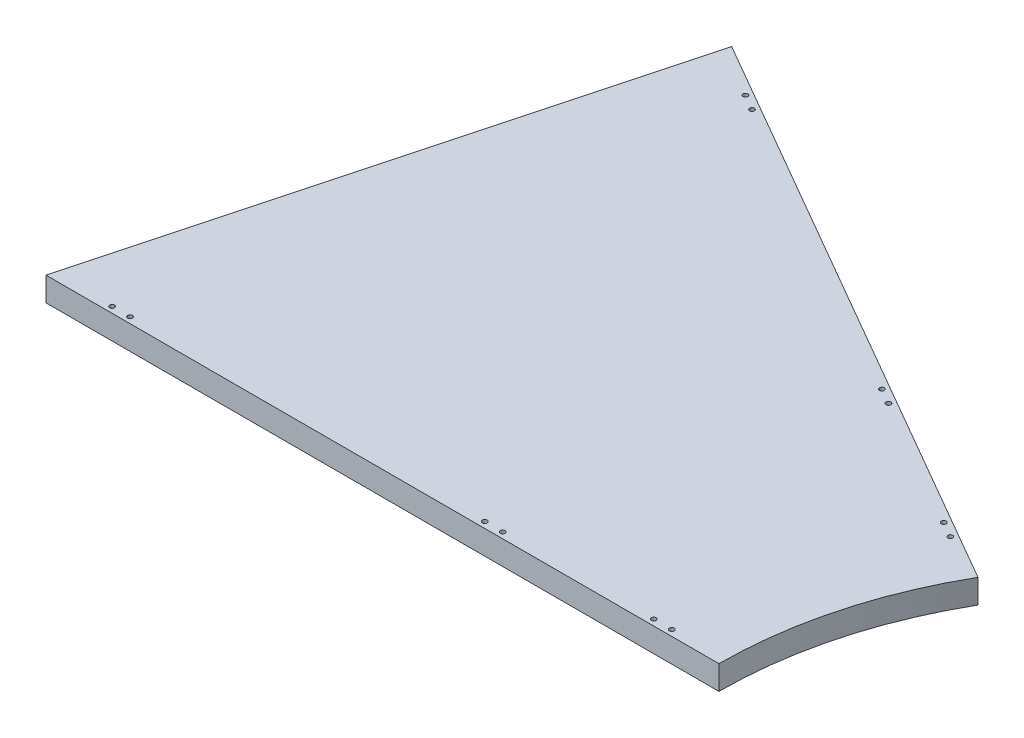
ISO-10303-21;
HEADER;
FILE_DESCRIPTION(('STEP AP214'),'2;1');
FILE_NAME('part.step','',(''),(''),'','','');
FILE_SCHEMA(('AUTOMOTIVE_DESIGN { 1 0 10303 214 1 1 1 1 }'));
ENDSEC;
DATA;
#1=APPLICATION_CONTEXT('core data for automotive mechanical design processes');
#2=APPLICATION_PROTOCOL_DEFINITION('international standard','automotive_design',2000,#1);
#3=PRODUCT_CONTEXT('',#1,'mechanical');
#4=PRODUCT('Part','Part','',(#3));
#5=PRODUCT_RELATED_PRODUCT_CATEGORY('part','',(#4));
#6=PRODUCT_DEFINITION_FORMATION('','',#4);
#7=PRODUCT_DEFINITION_CONTEXT('part definition',#1,'design');
#8=PRODUCT_DEFINITION('design','',#6,#7);
#9=PRODUCT_DEFINITION_SHAPE('','',#8);
#10=(LENGTH_UNIT() NAMED_UNIT(*) SI_UNIT(.MILLI.,.METRE.));
#11=(NAMED_UNIT(*) PLANE_ANGLE_UNIT() SI_UNIT($,.RADIAN.));
#12=(NAMED_UNIT(*) SI_UNIT($,.STERADIAN.) SOLID_ANGLE_UNIT());
#13=UNCERTAINTY_MEASURE_WITH_UNIT(LENGTH_MEASURE(1.E-05),#10,'distance_accuracy_value','');
#14=(GEOMETRIC_REPRESENTATION_CONTEXT(3) GLOBAL_UNCERTAINTY_ASSIGNED_CONTEXT((#13)) GLOBAL_UNIT_ASSIGNED_CONTEXT((#10,
#11,#12)) REPRESENTATION_CONTEXT('',''));
#15=CARTESIAN_POINT('',(0.,0.,0.));
#16=DIRECTION('',(0.,0.,1.));
#17=DIRECTION('',(1.,0.,0.));
#18=AXIS2_PLACEMENT_3D('',#15,#16,#17);
#19=CARTESIAN_POINT('',(-779.422863405994,20.,-450.000000000001));
#20=DIRECTION('',(0.965925826289068,0.,0.258819045102522));
#21=DIRECTION('',(0.258819045102522,0.,-0.965925826289068));
#22=AXIS2_PLACEMENT_3D('',#19,#20,#21);
#23=PLANE('',#22);
#24=DIRECTION('',(-0.258819045102522,0.,0.965925826289068));
#25=VECTOR('',#24,1.);
#26=CARTESIAN_POINT('',(-779.422863405994,0.,-450.000000000001));
#27=LINE('',#26,#25);
#28=CARTESIAN_POINT('',(-779.422863405994,0.,-450.000000000001));
#29=VERTEX_POINT('',#28);
#30=CARTESIAN_POINT('',(-900.,0.,0.));
#31=VERTEX_POINT('',#30);
#32=EDGE_CURVE('E113',#29,#31,#27,.T.);
#33=ORIENTED_EDGE('',*,*,#32,.T.);
#34=DIRECTION('',(0.,-1.,0.));
#35=VECTOR('',#34,1.);
#36=CARTESIAN_POINT('',(-900.,20.,0.));
#37=LINE('',#36,#35);
#38=CARTESIAN_POINT('',(-900.,20.,0.));
#39=VERTEX_POINT('',#38);
#40=EDGE_CURVE('E11',#39,#31,#37,.T.);
#41=ORIENTED_EDGE('',*,*,#40,.F.);
#42=DIRECTION('',(-0.258819045102522,0.,0.965925826289068));
#43=VECTOR('',#42,1.);
#44=CARTESIAN_POINT('',(-779.422863405994,20.,-450.000000000001));
#45=LINE('',#44,#43);
#46=CARTESIAN_POINT('',(-779.422863405994,20.,-450.000000000001));
#47=VERTEX_POINT('',#46);
#48=EDGE_CURVE('E97',#47,#39,#45,.T.);
#49=ORIENTED_EDGE('',*,*,#48,.F.);
#50=DIRECTION('',(0.,-1.,0.));
#51=VECTOR('',#50,1.);
#52=CARTESIAN_POINT('',(-779.422863405994,20.,-450.000000000001));
#53=LINE('',#52,#51);
#54=EDGE_CURVE('E109',#47,#29,#53,.T.);
#55=ORIENTED_EDGE('',*,*,#54,.T.);
#56=EDGE_LOOP('',(#33,#41,#49,#55));
#57=FACE_BOUND('',#56,.T.);
#58=ADVANCED_FACE('F45',(#57),#23,.F.);
#59=CARTESIAN_POINT('',(-340.,20.,0.));
#60=DIRECTION('',(0.,0.,-1.));
#61=DIRECTION('',(-1.,0.,0.));
#62=AXIS2_PLACEMENT_3D('',#59,#60,#61);
#63=PLANE('',#62);
#64=DIRECTION('',(1.,0.,0.));
#65=VECTOR('',#64,1.);
#66=CARTESIAN_POINT('',(-340.,0.,0.));
#67=LINE('',#66,#65);
#68=CARTESIAN_POINT('',(-340.,0.,0.));
#69=VERTEX_POINT('',#68);
#70=EDGE_CURVE('E102',#31,#69,#67,.T.);
#71=ORIENTED_EDGE('',*,*,#70,.T.);
#72=DIRECTION('',(0.,-1.,0.));
#73=VECTOR('',#72,1.);
#74=CARTESIAN_POINT('',(-340.,20.,0.));
#75=LINE('',#74,#73);
#76=CARTESIAN_POINT('',(-340.,20.,0.));
#77=VERTEX_POINT('',#76);
#78=EDGE_CURVE('E54',#77,#69,#75,.T.);
#79=ORIENTED_EDGE('',*,*,#78,.F.);
#80=DIRECTION('',(1.,0.,0.));
#81=VECTOR('',#80,1.);
#82=CARTESIAN_POINT('',(-340.,20.,0.));
#83=LINE('',#82,#81);
#84=EDGE_CURVE('E92',#39,#77,#83,.T.);
#85=ORIENTED_EDGE('',*,*,#84,.F.);
#86=ORIENTED_EDGE('',*,*,#40,.T.);
#87=EDGE_LOOP('',(#71,#79,#85,#86));
#88=FACE_BOUND('',#87,.T.);
#89=ADVANCED_FACE('F101',(#88),#63,.F.);
#90=CARTESIAN_POINT('',(0.,20.,0.));
#91=DIRECTION('',(0.,-1.,0.));
#92=DIRECTION('',(0.,0.,-1.));
#93=AXIS2_PLACEMENT_3D('',#90,#91,#92);
#94=CYLINDRICAL_SURFACE('',#93,340.);
#95=CARTESIAN_POINT('',(0.,0.,0.));
#96=DIRECTION('',(0.,-1.,0.));
#97=DIRECTION('',(0.,0.,1.));
#98=AXIS2_PLACEMENT_3D('',#95,#96,#97);
#99=CIRCLE('',#98,340.);
#100=CARTESIAN_POINT('',(-294.448637286709,0.,-170.));
#101=VERTEX_POINT('',#100);
#102=EDGE_CURVE('E79',#69,#101,#99,.T.);
#103=ORIENTED_EDGE('',*,*,#102,.T.);
#104=DIRECTION('',(0.,-1.,0.));
#105=VECTOR('',#104,1.);
#106=CARTESIAN_POINT('',(-294.448637286709,20.,-170.));
#107=LINE('',#106,#105);
#108=CARTESIAN_POINT('',(-294.448637286709,20.,-170.));
#109=VERTEX_POINT('',#108);
#110=EDGE_CURVE('E104',#109,#101,#107,.T.);
#111=ORIENTED_EDGE('',*,*,#110,.F.);
#112=CARTESIAN_POINT('',(0.,20.,0.));
#113=DIRECTION('',(0.,-1.,0.));
#114=DIRECTION('',(0.,0.,1.));
#115=AXIS2_PLACEMENT_3D('',#112,#113,#114);
#116=CIRCLE('',#115,340.);
#117=EDGE_CURVE('E95',#77,#109,#116,.T.);
#118=ORIENTED_EDGE('',*,*,#117,.F.);
#119=ORIENTED_EDGE('',*,*,#78,.T.);
#120=EDGE_LOOP('',(#103,#111,#118,#119));
#121=FACE_BOUND('',#120,.T.);
#122=ADVANCED_FACE('F105',(#121),#94,.F.);
#123=CARTESIAN_POINT('',(-294.448637286709,20.,-170.));
#124=DIRECTION('',(-0.500000000000001,0.,0.866025403784438));
#125=DIRECTION('',(0.866025403784438,0.,0.500000000000001));
#126=AXIS2_PLACEMENT_3D('',#123,#124,#125);
#127=PLANE('',#126);
#128=DIRECTION('',(-0.866025403784438,0.,-0.500000000000001));
#129=VECTOR('',#128,1.);
#130=CARTESIAN_POINT('',(-294.448637286709,0.,-170.));
#131=LINE('',#130,#129);
#132=EDGE_CURVE('E85',#101,#29,#131,.T.);
#133=ORIENTED_EDGE('',*,*,#132,.T.);
#134=ORIENTED_EDGE('',*,*,#54,.F.);
#135=DIRECTION('',(-0.866025403784438,0.,-0.500000000000001));
#136=VECTOR('',#135,1.);
#137=CARTESIAN_POINT('',(-294.448637286709,20.,-170.));
#138=LINE('',#137,#136);
#139=EDGE_CURVE('E62',#109,#47,#138,.T.);
#140=ORIENTED_EDGE('',*,*,#139,.F.);
#141=ORIENTED_EDGE('',*,*,#110,.T.);
#142=EDGE_LOOP('',(#133,#134,#140,#141));
#143=FACE_BOUND('',#142,.T.);
#144=ADVANCED_FACE('F127',(#143),#127,.F.);
#145=CARTESIAN_POINT('',(0.,20.,0.));
#146=DIRECTION('',(0.,1.,0.));
#147=DIRECTION('',(0.,0.,1.));
#148=AXIS2_PLACEMENT_3D('',#145,#146,#147);
#149=PLANE('',#148);
#150=CARTESIAN_POINT('',(-850.,20.,-5.));
#151=DIRECTION('',(0.,-1.,0.));
#152=DIRECTION('',(0.,0.,-1.));
#153=AXIS2_PLACEMENT_3D('',#150,#151,#152);
#154=CIRCLE('',#153,2.);
#155=CARTESIAN_POINT('',(-850.,20.,-7.));
#156=VERTEX_POINT('',#155);
#157=EDGE_CURVE('E117',#156,#156,#154,.T.);
#158=ORIENTED_EDGE('',*,*,#157,.T.);
#159=EDGE_LOOP('',(#158));
#160=FACE_BOUND('',#159,.T.);
#161=CARTESIAN_POINT('',(-384.25,20.,-5.));
#162=DIRECTION('',(0.,-1.,0.));
#163=DIRECTION('',(0.,0.,-1.));
#164=AXIS2_PLACEMENT_3D('',#161,#162,#163);
#165=CIRCLE('',#164,2.);
#166=CARTESIAN_POINT('',(-384.25,20.,-7.));
#167=VERTEX_POINT('',#166);
#168=EDGE_CURVE('E202',#167,#167,#165,.T.);
#169=ORIENTED_EDGE('',*,*,#168,.T.);
#170=EDGE_LOOP('',(#169));
#171=FACE_BOUND('',#170,.T.);
#172=CARTESIAN_POINT('',(-348.260642460939,20.,-195.294872981073));
#173=DIRECTION('',(0.,-1.,0.));
#174=DIRECTION('',(0.,0.,1.));
#175=AXIS2_PLACEMENT_3D('',#172,#173,#174);
#176=CIRCLE('',#175,2.);
#177=CARTESIAN_POINT('',(-348.260642460939,20.,-193.294872981073));
#178=VERTEX_POINT('',#177);
#179=EDGE_CURVE('E193',#178,#178,#176,.T.);
#180=ORIENTED_EDGE('',*,*,#179,.T.);
#181=EDGE_LOOP('',(#180));
#182=FACE_BOUND('',#181,.T.);
#183=CARTESIAN_POINT('',(-335.270261404173,20.,-187.794872981074));
#184=DIRECTION('',(0.,-1.,0.));
#185=DIRECTION('',(0.,0.,1.));
#186=AXIS2_PLACEMENT_3D('',#183,#184,#185);
#187=CIRCLE('',#186,1.99999999999999);
#188=CARTESIAN_POINT('',(-335.270261404173,20.,-185.794872981074));
#189=VERTEX_POINT('',#188);
#190=EDGE_CURVE('E216',#189,#189,#187,.T.);
#191=ORIENTED_EDGE('',*,*,#190,.T.);
#192=EDGE_LOOP('',(#191));
#193=FACE_BOUND('',#192,.T.);
#194=CARTESIAN_POINT('',(-457.085394700493,20.,-258.124872981072));
#195=DIRECTION('',(0.,-1.,0.));
#196=DIRECTION('',(0.,0.,1.));
#197=AXIS2_PLACEMENT_3D('',#194,#195,#196);
#198=CIRCLE('',#197,2.00000000000009);
#199=CARTESIAN_POINT('',(-457.085394700493,20.,-256.124872981072));
#200=VERTEX_POINT('',#199);
#201=EDGE_CURVE('E158',#200,#200,#198,.T.);
#202=ORIENTED_EDGE('',*,*,#201,.T.);
#203=EDGE_LOOP('',(#202));
#204=FACE_BOUND('',#203,.T.);
#205=CARTESIAN_POINT('',(-399.25,20.,-5.));
#206=DIRECTION('',(0.,-1.,0.));
#207=DIRECTION('',(0.,0.,-1.));
#208=AXIS2_PLACEMENT_3D('',#205,#206,#207);
#209=CIRCLE('',#208,2.);
#210=CARTESIAN_POINT('',(-399.25,20.,-7.));
#211=VERTEX_POINT('',#210);
#212=EDGE_CURVE('E159',#211,#211,#209,.T.);
#213=ORIENTED_EDGE('',*,*,#212,.T.);
#214=EDGE_LOOP('',(#213));
#215=FACE_BOUND('',#214,.T.);
#216=CARTESIAN_POINT('',(-524.91,20.,-5.));
#217=DIRECTION('',(0.,-1.,0.));
#218=DIRECTION('',(0.,0.,-1.));
#219=AXIS2_PLACEMENT_3D('',#216,#217,#218);
#220=CIRCLE('',#219,2.);
#221=CARTESIAN_POINT('',(-524.91,20.,-7.));
#222=VERTEX_POINT('',#221);
#223=EDGE_CURVE('E168',#222,#222,#220,.T.);
#224=ORIENTED_EDGE('',*,*,#223,.T.);
#225=EDGE_LOOP('',(#224));
#226=FACE_BOUND('',#225,.T.);
#227=CARTESIAN_POINT('',(-539.91,20.,-5.));
#228=DIRECTION('',(0.,-1.,0.));
#229=DIRECTION('',(0.,0.,-1.));
#230=AXIS2_PLACEMENT_3D('',#227,#228,#229);
#231=CIRCLE('',#230,2.);
#232=CARTESIAN_POINT('',(-539.91,20.,-7.));
#233=VERTEX_POINT('',#232);
#234=EDGE_CURVE('E176',#233,#233,#231,.T.);
#235=ORIENTED_EDGE('',*,*,#234,.T.);
#236=EDGE_LOOP('',(#235));
#237=FACE_BOUND('',#236,.T.);
#238=CARTESIAN_POINT('',(-835.,20.,-5.));
#239=DIRECTION('',(0.,-1.,0.));
#240=DIRECTION('',(0.,0.,-1.));
#241=AXIS2_PLACEMENT_3D('',#238,#239,#240);
#242=CIRCLE('',#241,2.);
#243=CARTESIAN_POINT('',(-835.,20.,-7.));
#244=VERTEX_POINT('',#243);
#245=EDGE_CURVE('E184',#244,#244,#242,.T.);
#246=ORIENTED_EDGE('',*,*,#245,.T.);
#247=EDGE_LOOP('',(#246));
#248=FACE_BOUND('',#247,.T.);
#249=CARTESIAN_POINT('',(-470.07577575726,20.,-265.624872981072));
#250=DIRECTION('',(0.,-1.,0.));
#251=DIRECTION('',(0.,0.,1.));
#252=AXIS2_PLACEMENT_3D('',#249,#250,#251);
#253=CIRCLE('',#252,2.);
#254=CARTESIAN_POINT('',(-470.07577575726,20.,-263.624872981072));
#255=VERTEX_POINT('',#254);
#256=EDGE_CURVE('E150',#255,#255,#253,.T.);
#257=ORIENTED_EDGE('',*,*,#256,.T.);
#258=EDGE_LOOP('',(#257));
#259=FACE_BOUND('',#258,.T.);
#260=CARTESIAN_POINT('',(-725.631212160012,20.,-413.169872981069));
#261=DIRECTION('',(0.,-1.,0.));
#262=DIRECTION('',(0.,0.,1.));
#263=AXIS2_PLACEMENT_3D('',#260,#261,#262);
#264=CIRCLE('',#263,2.0000000000002);
#265=CARTESIAN_POINT('',(-725.631212160012,20.,-411.169872981068));
#266=VERTEX_POINT('',#265);
#267=EDGE_CURVE('E142',#266,#266,#264,.T.);
#268=ORIENTED_EDGE('',*,*,#267,.T.);
#269=EDGE_LOOP('',(#268));
#270=FACE_BOUND('',#269,.T.);
#271=CARTESIAN_POINT('',(-738.621593216778,20.,-420.669872981068));
#272=DIRECTION('',(0.,-1.,0.));
#273=DIRECTION('',(0.,0.,1.));
#274=AXIS2_PLACEMENT_3D('',#271,#272,#273);
#275=CIRCLE('',#274,1.99999999999999);
#276=CARTESIAN_POINT('',(-738.621593216778,20.,-418.669872981068));
#277=VERTEX_POINT('',#276);
#278=EDGE_CURVE('E134',#277,#277,#275,.T.);
#279=ORIENTED_EDGE('',*,*,#278,.T.);
#280=EDGE_LOOP('',(#279));
#281=FACE_BOUND('',#280,.T.);
#282=ORIENTED_EDGE('',*,*,#48,.T.);
#283=ORIENTED_EDGE('',*,*,#84,.T.);
#284=ORIENTED_EDGE('',*,*,#117,.T.);
#285=ORIENTED_EDGE('',*,*,#139,.T.);
#286=EDGE_LOOP('',(#282,#283,#284,#285));
#287=FACE_BOUND('',#286,.T.);
#288=ADVANCED_FACE('F93',(#160,#171,#182,#193,#204,#215,#226,#237,#248,#259,#270,#281,#287),
#149,.T.);
#289=CARTESIAN_POINT('',(0.,0.,0.));
#290=DIRECTION('',(0.,1.,0.));
#291=DIRECTION('',(0.,0.,1.));
#292=AXIS2_PLACEMENT_3D('',#289,#290,#291);
#293=PLANE('',#292);
#294=CARTESIAN_POINT('',(-850.,0.,-5.));
#295=DIRECTION('',(0.,-1.,0.));
#296=DIRECTION('',(0.,0.,-1.));
#297=AXIS2_PLACEMENT_3D('',#294,#295,#296);
#298=CIRCLE('',#297,2.);
#299=CARTESIAN_POINT('',(-850.,0.,-7.));
#300=VERTEX_POINT('',#299);
#301=EDGE_CURVE('E192',#300,#300,#298,.T.);
#302=ORIENTED_EDGE('',*,*,#301,.F.);
#303=EDGE_LOOP('',(#302));
#304=FACE_BOUND('',#303,.T.);
#305=CARTESIAN_POINT('',(-384.25,0.,-5.));
#306=DIRECTION('',(0.,-1.,0.));
#307=DIRECTION('',(0.,0.,-1.));
#308=AXIS2_PLACEMENT_3D('',#305,#306,#307);
#309=CIRCLE('',#308,2.);
#310=CARTESIAN_POINT('',(-384.25,0.,-7.));
#311=VERTEX_POINT('',#310);
#312=EDGE_CURVE('E164',#311,#311,#309,.T.);
#313=ORIENTED_EDGE('',*,*,#312,.F.);
#314=EDGE_LOOP('',(#313));
#315=FACE_BOUND('',#314,.T.);
#316=CARTESIAN_POINT('',(-348.260642460939,0.,-195.294872981073));
#317=DIRECTION('',(0.,-1.,0.));
#318=DIRECTION('',(0.,0.,1.));
#319=AXIS2_PLACEMENT_3D('',#316,#317,#318);
#320=CIRCLE('',#319,2.);
#321=CARTESIAN_POINT('',(-348.260642460939,0.,-193.294872981073));
#322=VERTEX_POINT('',#321);
#323=EDGE_CURVE('E197',#322,#322,#320,.T.);
#324=ORIENTED_EDGE('',*,*,#323,.F.);
#325=EDGE_LOOP('',(#324));
#326=FACE_BOUND('',#325,.T.);
#327=CARTESIAN_POINT('',(-335.270261404173,0.,-187.794872981074));
#328=DIRECTION('',(0.,-1.,0.));
#329=DIRECTION('',(0.,0.,1.));
#330=AXIS2_PLACEMENT_3D('',#327,#328,#329);
#331=CIRCLE('',#330,1.99999999999999);
#332=CARTESIAN_POINT('',(-335.270261404173,0.,-185.794872981074));
#333=VERTEX_POINT('',#332);
#334=EDGE_CURVE('E198',#333,#333,#331,.T.);
#335=ORIENTED_EDGE('',*,*,#334,.F.);
#336=EDGE_LOOP('',(#335));
#337=FACE_BOUND('',#336,.T.);
#338=CARTESIAN_POINT('',(-457.085394700493,0.,-258.124872981072));
#339=DIRECTION('',(0.,-1.,0.));
#340=DIRECTION('',(0.,0.,1.));
#341=AXIS2_PLACEMENT_3D('',#338,#339,#340);
#342=CIRCLE('',#341,2.00000000000009);
#343=CARTESIAN_POINT('',(-457.085394700493,0.,-256.124872981072));
#344=VERTEX_POINT('',#343);
#345=EDGE_CURVE('E212',#344,#344,#342,.T.);
#346=ORIENTED_EDGE('',*,*,#345,.F.);
#347=EDGE_LOOP('',(#346));
#348=FACE_BOUND('',#347,.T.);
#349=CARTESIAN_POINT('',(-399.25,0.,-5.));
#350=DIRECTION('',(0.,-1.,0.));
#351=DIRECTION('',(0.,0.,-1.));
#352=AXIS2_PLACEMENT_3D('',#349,#350,#351);
#353=CIRCLE('',#352,2.);
#354=CARTESIAN_POINT('',(-399.25,0.,-7.));
#355=VERTEX_POINT('',#354);
#356=EDGE_CURVE('E163',#355,#355,#353,.T.);
#357=ORIENTED_EDGE('',*,*,#356,.F.);
#358=EDGE_LOOP('',(#357));
#359=FACE_BOUND('',#358,.T.);
#360=CARTESIAN_POINT('',(-524.91,0.,-5.));
#361=DIRECTION('',(0.,-1.,0.));
#362=DIRECTION('',(0.,0.,-1.));
#363=AXIS2_PLACEMENT_3D('',#360,#361,#362);
#364=CIRCLE('',#363,2.);
#365=CARTESIAN_POINT('',(-524.91,0.,-7.));
#366=VERTEX_POINT('',#365);
#367=EDGE_CURVE('E172',#366,#366,#364,.T.);
#368=ORIENTED_EDGE('',*,*,#367,.F.);
#369=EDGE_LOOP('',(#368));
#370=FACE_BOUND('',#369,.T.);
#371=CARTESIAN_POINT('',(-539.91,0.,-5.));
#372=DIRECTION('',(0.,-1.,0.));
#373=DIRECTION('',(0.,0.,-1.));
#374=AXIS2_PLACEMENT_3D('',#371,#372,#373);
#375=CIRCLE('',#374,2.);
#376=CARTESIAN_POINT('',(-539.91,0.,-7.));
#377=VERTEX_POINT('',#376);
#378=EDGE_CURVE('E180',#377,#377,#375,.T.);
#379=ORIENTED_EDGE('',*,*,#378,.F.);
#380=EDGE_LOOP('',(#379));
#381=FACE_BOUND('',#380,.T.);
#382=CARTESIAN_POINT('',(-835.,0.,-5.));
#383=DIRECTION('',(0.,-1.,0.));
#384=DIRECTION('',(0.,0.,-1.));
#385=AXIS2_PLACEMENT_3D('',#382,#383,#384);
#386=CIRCLE('',#385,2.);
#387=CARTESIAN_POINT('',(-835.,0.,-7.));
#388=VERTEX_POINT('',#387);
#389=EDGE_CURVE('E188',#388,#388,#386,.T.);
#390=ORIENTED_EDGE('',*,*,#389,.F.);
#391=EDGE_LOOP('',(#390));
#392=FACE_BOUND('',#391,.T.);
#393=CARTESIAN_POINT('',(-470.07577575726,0.,-265.624872981072));
#394=DIRECTION('',(0.,-1.,0.));
#395=DIRECTION('',(0.,0.,1.));
#396=AXIS2_PLACEMENT_3D('',#393,#394,#395);
#397=CIRCLE('',#396,2.);
#398=CARTESIAN_POINT('',(-470.07577575726,0.,-263.624872981072));
#399=VERTEX_POINT('',#398);
#400=EDGE_CURVE('E154',#399,#399,#397,.T.);
#401=ORIENTED_EDGE('',*,*,#400,.F.);
#402=EDGE_LOOP('',(#401));
#403=FACE_BOUND('',#402,.T.);
#404=CARTESIAN_POINT('',(-725.631212160012,0.,-413.169872981069));
#405=DIRECTION('',(0.,-1.,0.));
#406=DIRECTION('',(0.,0.,1.));
#407=AXIS2_PLACEMENT_3D('',#404,#405,#406);
#408=CIRCLE('',#407,2.0000000000002);
#409=CARTESIAN_POINT('',(-725.631212160012,0.,-411.169872981068));
#410=VERTEX_POINT('',#409);
#411=EDGE_CURVE('E146',#410,#410,#408,.T.);
#412=ORIENTED_EDGE('',*,*,#411,.F.);
#413=EDGE_LOOP('',(#412));
#414=FACE_BOUND('',#413,.T.);
#415=CARTESIAN_POINT('',(-738.621593216778,0.,-420.669872981068));
#416=DIRECTION('',(0.,-1.,0.));
#417=DIRECTION('',(0.,0.,1.));
#418=AXIS2_PLACEMENT_3D('',#415,#416,#417);
#419=CIRCLE('',#418,1.99999999999999);
#420=CARTESIAN_POINT('',(-738.621593216778,0.,-418.669872981068));
#421=VERTEX_POINT('',#420);
#422=EDGE_CURVE('E138',#421,#421,#419,.T.);
#423=ORIENTED_EDGE('',*,*,#422,.F.);
#424=EDGE_LOOP('',(#423));
#425=FACE_BOUND('',#424,.T.);
#426=ORIENTED_EDGE('',*,*,#32,.F.);
#427=ORIENTED_EDGE('',*,*,#132,.F.);
#428=ORIENTED_EDGE('',*,*,#102,.F.);
#429=ORIENTED_EDGE('',*,*,#70,.F.);
#430=EDGE_LOOP('',(#426,#427,#428,#429));
#431=FACE_BOUND('',#430,.T.);
#432=ADVANCED_FACE('F130',(#304,#315,#326,#337,#348,#359,#370,#381,#392,#403,#414,#425,#431),
#293,.F.);
#433=CARTESIAN_POINT('',(-738.621593216778,20.,-420.669872981068));
#434=DIRECTION('',(0.,-1.,0.));
#435=DIRECTION('',(0.,0.,-1.));
#436=AXIS2_PLACEMENT_3D('',#433,#434,#435);
#437=CYLINDRICAL_SURFACE('',#436,1.99999999999999);
#438=ORIENTED_EDGE('',*,*,#278,.F.);
#439=EDGE_LOOP('',(#438));
#440=FACE_BOUND('',#439,.T.);
#441=ORIENTED_EDGE('',*,*,#422,.T.);
#442=EDGE_LOOP('',(#441));
#443=FACE_BOUND('',#442,.T.);
#444=ADVANCED_FACE('F241',(#440,#443),#437,.F.);
#445=CARTESIAN_POINT('',(-725.631212160012,20.,-413.169872981069));
#446=DIRECTION('',(0.,-1.,0.));
#447=DIRECTION('',(0.,0.,-1.));
#448=AXIS2_PLACEMENT_3D('',#445,#446,#447);
#449=CYLINDRICAL_SURFACE('',#448,2.0000000000002);
#450=ORIENTED_EDGE('',*,*,#267,.F.);
#451=EDGE_LOOP('',(#450));
#452=FACE_BOUND('',#451,.T.);
#453=ORIENTED_EDGE('',*,*,#411,.T.);
#454=EDGE_LOOP('',(#453));
#455=FACE_BOUND('',#454,.T.);
#456=ADVANCED_FACE('F266',(#452,#455),#449,.F.);
#457=CARTESIAN_POINT('',(-470.07577575726,20.,-265.624872981072));
#458=DIRECTION('',(0.,-1.,0.));
#459=DIRECTION('',(0.,0.,-1.));
#460=AXIS2_PLACEMENT_3D('',#457,#458,#459);
#461=CYLINDRICAL_SURFACE('',#460,2.);
#462=ORIENTED_EDGE('',*,*,#256,.F.);
#463=EDGE_LOOP('',(#462));
#464=FACE_BOUND('',#463,.T.);
#465=ORIENTED_EDGE('',*,*,#400,.T.);
#466=EDGE_LOOP('',(#465));
#467=FACE_BOUND('',#466,.T.);
#468=ADVANCED_FACE('F272',(#464,#467),#461,.F.);
#469=CARTESIAN_POINT('',(-835.,20.,-5.));
#470=DIRECTION('',(0.,-1.,0.));
#471=DIRECTION('',(0.,0.,-1.));
#472=AXIS2_PLACEMENT_3D('',#469,#470,#471);
#473=CYLINDRICAL_SURFACE('',#472,2.);
#474=ORIENTED_EDGE('',*,*,#245,.F.);
#475=EDGE_LOOP('',(#474));
#476=FACE_BOUND('',#475,.T.);
#477=ORIENTED_EDGE('',*,*,#389,.T.);
#478=EDGE_LOOP('',(#477));
#479=FACE_BOUND('',#478,.T.);
#480=ADVANCED_FACE('F315',(#476,#479),#473,.F.);
#481=CARTESIAN_POINT('',(-539.91,20.,-5.));
#482=DIRECTION('',(0.,-1.,0.));
#483=DIRECTION('',(0.,0.,-1.));
#484=AXIS2_PLACEMENT_3D('',#481,#482,#483);
#485=CYLINDRICAL_SURFACE('',#484,2.);
#486=ORIENTED_EDGE('',*,*,#234,.F.);
#487=EDGE_LOOP('',(#486));
#488=FACE_BOUND('',#487,.T.);
#489=ORIENTED_EDGE('',*,*,#378,.T.);
#490=EDGE_LOOP('',(#489));
#491=FACE_BOUND('',#490,.T.);
#492=ADVANCED_FACE('F325',(#488,#491),#485,.F.);
#493=CARTESIAN_POINT('',(-524.91,20.,-5.));
#494=DIRECTION('',(0.,-1.,0.));
#495=DIRECTION('',(0.,0.,-1.));
#496=AXIS2_PLACEMENT_3D('',#493,#494,#495);
#497=CYLINDRICAL_SURFACE('',#496,2.);
#498=ORIENTED_EDGE('',*,*,#223,.F.);
#499=EDGE_LOOP('',(#498));
#500=FACE_BOUND('',#499,.T.);
#501=ORIENTED_EDGE('',*,*,#367,.T.);
#502=EDGE_LOOP('',(#501));
#503=FACE_BOUND('',#502,.T.);
#504=ADVANCED_FACE('F335',(#500,#503),#497,.F.);
#505=CARTESIAN_POINT('',(-399.25,20.,-5.));
#506=DIRECTION('',(0.,-1.,0.));
#507=DIRECTION('',(0.,0.,-1.));
#508=AXIS2_PLACEMENT_3D('',#505,#506,#507);
#509=CYLINDRICAL_SURFACE('',#508,2.);
#510=ORIENTED_EDGE('',*,*,#212,.F.);
#511=EDGE_LOOP('',(#510));
#512=FACE_BOUND('',#511,.T.);
#513=ORIENTED_EDGE('',*,*,#356,.T.);
#514=EDGE_LOOP('',(#513));
#515=FACE_BOUND('',#514,.T.);
#516=ADVANCED_FACE('F345',(#512,#515),#509,.F.);
#517=CARTESIAN_POINT('',(-457.085394700493,20.,-258.124872981072));
#518=DIRECTION('',(0.,-1.,0.));
#519=DIRECTION('',(0.,0.,-1.));
#520=AXIS2_PLACEMENT_3D('',#517,#518,#519);
#521=CYLINDRICAL_SURFACE('',#520,2.00000000000009);
#522=ORIENTED_EDGE('',*,*,#201,.F.);
#523=EDGE_LOOP('',(#522));
#524=FACE_BOUND('',#523,.T.);
#525=ORIENTED_EDGE('',*,*,#345,.T.);
#526=EDGE_LOOP('',(#525));
#527=FACE_BOUND('',#526,.T.);
#528=ADVANCED_FACE('F355',(#524,#527),#521,.F.);
#529=CARTESIAN_POINT('',(-335.270261404173,20.,-187.794872981074));
#530=DIRECTION('',(0.,-1.,0.));
#531=DIRECTION('',(0.,0.,-1.));
#532=AXIS2_PLACEMENT_3D('',#529,#530,#531);
#533=CYLINDRICAL_SURFACE('',#532,1.99999999999999);
#534=ORIENTED_EDGE('',*,*,#190,.F.);
#535=EDGE_LOOP('',(#534));
#536=FACE_BOUND('',#535,.T.);
#537=ORIENTED_EDGE('',*,*,#334,.T.);
#538=EDGE_LOOP('',(#537));
#539=FACE_BOUND('',#538,.T.);
#540=ADVANCED_FACE('F365',(#536,#539),#533,.F.);
#541=CARTESIAN_POINT('',(-348.260642460939,20.,-195.294872981073));
#542=DIRECTION('',(0.,-1.,0.));
#543=DIRECTION('',(0.,0.,-1.));
#544=AXIS2_PLACEMENT_3D('',#541,#542,#543);
#545=CYLINDRICAL_SURFACE('',#544,2.);
#546=ORIENTED_EDGE('',*,*,#179,.F.);
#547=EDGE_LOOP('',(#546));
#548=FACE_BOUND('',#547,.T.);
#549=ORIENTED_EDGE('',*,*,#323,.T.);
#550=EDGE_LOOP('',(#549));
#551=FACE_BOUND('',#550,.T.);
#552=ADVANCED_FACE('F375',(#548,#551),#545,.F.);
#553=CARTESIAN_POINT('',(-384.25,20.,-5.));
#554=DIRECTION('',(0.,-1.,0.));
#555=DIRECTION('',(0.,0.,-1.));
#556=AXIS2_PLACEMENT_3D('',#553,#554,#555);
#557=CYLINDRICAL_SURFACE('',#556,2.);
#558=ORIENTED_EDGE('',*,*,#168,.F.);
#559=EDGE_LOOP('',(#558));
#560=FACE_BOUND('',#559,.T.);
#561=ORIENTED_EDGE('',*,*,#312,.T.);
#562=EDGE_LOOP('',(#561));
#563=FACE_BOUND('',#562,.T.);
#564=ADVANCED_FACE('F235',(#560,#563),#557,.F.);
#565=CARTESIAN_POINT('',(-850.,20.,-5.));
#566=DIRECTION('',(0.,-1.,0.));
#567=DIRECTION('',(0.,0.,-1.));
#568=AXIS2_PLACEMENT_3D('',#565,#566,#567);
#569=CYLINDRICAL_SURFACE('',#568,2.);
#570=ORIENTED_EDGE('',*,*,#157,.F.);
#571=EDGE_LOOP('',(#570));
#572=FACE_BOUND('',#571,.T.);
#573=ORIENTED_EDGE('',*,*,#301,.T.);
#574=EDGE_LOOP('',(#573));
#575=FACE_BOUND('',#574,.T.);
#576=ADVANCED_FACE('F232',(#572,#575),#569,.F.);
#577=CLOSED_SHELL('',(#58,#89,#122,#144,#288,#432,#444,#456,#468,#480,#492,#504,#516,#528,#540,
#552,#564,#576));
#578=MANIFOLD_SOLID_BREP('B2',#577);
#579=ADVANCED_BREP_SHAPE_REPRESENTATION('',(#18,#578),#14);
#580=SHAPE_DEFINITION_REPRESENTATION(#9,#579);
ENDSEC;
END-ISO-10303-21;
